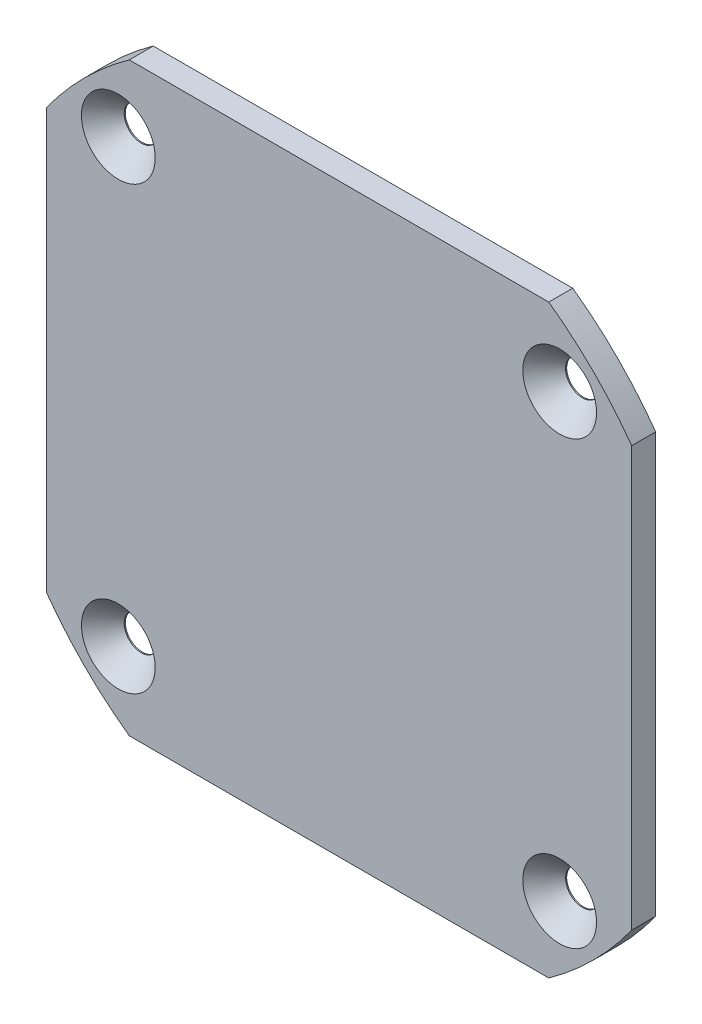
ISO-10303-21;
HEADER;
FILE_DESCRIPTION(('STEP AP214'),'2;1');
FILE_NAME('part.step','',(''),(''),'','','');
FILE_SCHEMA(('AUTOMOTIVE_DESIGN { 1 0 10303 214 1 1 1 1 }'));
ENDSEC;
DATA;
#1=APPLICATION_CONTEXT('core data for automotive mechanical design processes');
#2=APPLICATION_PROTOCOL_DEFINITION('international standard','automotive_design',2000,#1);
#3=PRODUCT_CONTEXT('',#1,'mechanical');
#4=PRODUCT('Part','Part','',(#3));
#5=PRODUCT_RELATED_PRODUCT_CATEGORY('part','',(#4));
#6=PRODUCT_DEFINITION_FORMATION('','',#4);
#7=PRODUCT_DEFINITION_CONTEXT('part definition',#1,'design');
#8=PRODUCT_DEFINITION('design','',#6,#7);
#9=PRODUCT_DEFINITION_SHAPE('','',#8);
#10=(LENGTH_UNIT() NAMED_UNIT(*) SI_UNIT(.MILLI.,.METRE.));
#11=(NAMED_UNIT(*) PLANE_ANGLE_UNIT() SI_UNIT($,.RADIAN.));
#12=(NAMED_UNIT(*) SI_UNIT($,.STERADIAN.) SOLID_ANGLE_UNIT());
#13=UNCERTAINTY_MEASURE_WITH_UNIT(LENGTH_MEASURE(1.E-05),#10,'distance_accuracy_value','');
#14=(GEOMETRIC_REPRESENTATION_CONTEXT(3) GLOBAL_UNCERTAINTY_ASSIGNED_CONTEXT((#13)) GLOBAL_UNIT_ASSIGNED_CONTEXT((#10,
#11,#12)) REPRESENTATION_CONTEXT('',''));
#15=CARTESIAN_POINT('',(0.,0.,0.));
#16=DIRECTION('',(0.,0.,1.));
#17=DIRECTION('',(1.,0.,0.));
#18=AXIS2_PLACEMENT_3D('',#15,#16,#17);
#19=CARTESIAN_POINT('',(0.,0.,0.));
#20=DIRECTION('',(0.,0.,1.));
#21=DIRECTION('',(1.,0.,0.));
#22=AXIS2_PLACEMENT_3D('',#19,#20,#21);
#23=PLANE('',#22);
#24=CARTESIAN_POINT('',(-29.1858323934746,29.1858323934749,0.));
#25=DIRECTION('',(0.,0.,1.));
#26=DIRECTION('',(1.,0.,0.));
#27=AXIS2_PLACEMENT_3D('',#24,#25,#26);
#28=CIRCLE('',#27,2.2479);
#29=CARTESIAN_POINT('',(-26.9379323934746,29.1858323934749,0.));
#30=VERTEX_POINT('',#29);
#31=EDGE_CURVE('E182',#30,#30,#28,.T.);
#32=ORIENTED_EDGE('',*,*,#31,.T.);
#33=EDGE_LOOP('',(#32));
#34=FACE_BOUND('',#33,.T.);
#35=CARTESIAN_POINT('',(-29.1858323934746,-29.1858323934749,0.));
#36=DIRECTION('',(0.,0.,1.));
#37=DIRECTION('',(1.,0.,0.));
#38=AXIS2_PLACEMENT_3D('',#35,#36,#37);
#39=CIRCLE('',#38,2.2479);
#40=CARTESIAN_POINT('',(-26.9379323934746,-29.1858323934749,0.));
#41=VERTEX_POINT('',#40);
#42=EDGE_CURVE('E173',#41,#41,#39,.T.);
#43=ORIENTED_EDGE('',*,*,#42,.T.);
#44=EDGE_LOOP('',(#43));
#45=FACE_BOUND('',#44,.T.);
#46=CARTESIAN_POINT('',(29.1858323934748,-29.1858323934747,0.));
#47=DIRECTION('',(0.,0.,1.));
#48=DIRECTION('',(1.,0.,0.));
#49=AXIS2_PLACEMENT_3D('',#46,#47,#48);
#50=CIRCLE('',#49,2.2479);
#51=CARTESIAN_POINT('',(31.4337323934748,-29.1858323934747,0.));
#52=VERTEX_POINT('',#51);
#53=EDGE_CURVE('E164',#52,#52,#50,.T.);
#54=ORIENTED_EDGE('',*,*,#53,.T.);
#55=EDGE_LOOP('',(#54));
#56=FACE_BOUND('',#55,.T.);
#57=CARTESIAN_POINT('',(29.1858323934746,29.1858323934749,0.));
#58=DIRECTION('',(0.,0.,1.));
#59=DIRECTION('',(1.,0.,0.));
#60=AXIS2_PLACEMENT_3D('',#57,#58,#59);
#61=CIRCLE('',#60,2.2479);
#62=CARTESIAN_POINT('',(31.4337323934746,29.1858323934749,0.));
#63=VERTEX_POINT('',#62);
#64=EDGE_CURVE('E149',#63,#63,#61,.T.);
#65=ORIENTED_EDGE('',*,*,#64,.T.);
#66=EDGE_LOOP('',(#65));
#67=FACE_BOUND('',#66,.T.);
#68=CARTESIAN_POINT('',(0.,0.,0.));
#69=DIRECTION('',(0.,0.,1.));
#70=DIRECTION('',(1.,0.,0.));
#71=AXIS2_PLACEMENT_3D('',#68,#69,#70);
#72=CIRCLE('',#71,38.1);
#73=CARTESIAN_POINT('',(38.1,0.,0.));
#74=VERTEX_POINT('',#73);
#75=EDGE_CURVE('E120',#74,#74,#72,.F.);
#76=ORIENTED_EDGE('',*,*,#75,.F.);
#77=EDGE_LOOP('',(#76));
#78=FACE_BOUND('',#77,.T.);
#79=DIRECTION('',(0.,1.,0.));
#80=VECTOR('',#79,1.);
#81=CARTESIAN_POINT('',(38.7108323934746,38.7108323934749,0.));
#82=LINE('',#81,#80);
#83=CARTESIAN_POINT('',(38.7108323934746,-27.7418831445221,0.));
#84=VERTEX_POINT('',#83);
#85=CARTESIAN_POINT('',(38.7108323934746,27.7418831445221,0.));
#86=VERTEX_POINT('',#85);
#87=EDGE_CURVE('E208',#84,#86,#82,.T.);
#88=ORIENTED_EDGE('',*,*,#87,.F.);
#89=CARTESIAN_POINT('',(0.,0.,0.));
#90=DIRECTION('',(0.,0.,1.));
#91=DIRECTION('',(1.,0.,0.));
#92=AXIS2_PLACEMENT_3D('',#89,#90,#91);
#93=CIRCLE('',#92,47.625);
#94=CARTESIAN_POINT('',(27.7418831445217,-38.7108323934749,0.));
#95=VERTEX_POINT('',#94);
#96=EDGE_CURVE('E145',#95,#84,#93,.T.);
#97=ORIENTED_EDGE('',*,*,#96,.F.);
#98=DIRECTION('',(1.,0.,0.));
#99=VECTOR('',#98,1.);
#100=CARTESIAN_POINT('',(-38.7108323934746,-38.7108323934749,0.));
#101=LINE('',#100,#99);
#102=CARTESIAN_POINT('',(-27.7418831445217,-38.7108323934749,0.));
#103=VERTEX_POINT('',#102);
#104=EDGE_CURVE('E202',#103,#95,#101,.T.);
#105=ORIENTED_EDGE('',*,*,#104,.F.);
#106=CARTESIAN_POINT('',(-38.7108323934746,-27.7418831445221,0.));
#107=VERTEX_POINT('',#106);
#108=EDGE_CURVE('E147',#107,#103,#93,.T.);
#109=ORIENTED_EDGE('',*,*,#108,.F.);
#110=DIRECTION('',(0.,-1.,0.));
#111=VECTOR('',#110,1.);
#112=CARTESIAN_POINT('',(-38.7108323934746,38.7108323934749,0.));
#113=LINE('',#112,#111);
#114=CARTESIAN_POINT('',(-38.7108323934746,27.7418831445221,0.));
#115=VERTEX_POINT('',#114);
#116=EDGE_CURVE('E204',#115,#107,#113,.T.);
#117=ORIENTED_EDGE('',*,*,#116,.F.);
#118=CARTESIAN_POINT('',(-27.7418831445217,38.7108323934749,0.));
#119=VERTEX_POINT('',#118);
#120=EDGE_CURVE('E144',#119,#115,#93,.T.);
#121=ORIENTED_EDGE('',*,*,#120,.F.);
#122=DIRECTION('',(-1.,0.,0.));
#123=VECTOR('',#122,1.);
#124=CARTESIAN_POINT('',(-38.7108323934746,38.7108323934749,0.));
#125=LINE('',#124,#123);
#126=CARTESIAN_POINT('',(27.7418831445217,38.7108323934749,0.));
#127=VERTEX_POINT('',#126);
#128=EDGE_CURVE('E206',#127,#119,#125,.T.);
#129=ORIENTED_EDGE('',*,*,#128,.F.);
#130=EDGE_CURVE('E129',#86,#127,#93,.T.);
#131=ORIENTED_EDGE('',*,*,#130,.F.);
#132=EDGE_LOOP('',(#88,#97,#105,#109,#117,#121,#129,#131));
#133=FACE_BOUND('',#132,.T.);
#134=ADVANCED_FACE('F44',(#34,#45,#56,#67,#78,#133),#23,.F.);
#135=CARTESIAN_POINT('',(0.,0.,3.175));
#136=DIRECTION('',(0.,0.,-1.));
#137=DIRECTION('',(-1.,0.,0.));
#138=AXIS2_PLACEMENT_3D('',#135,#136,#137);
#139=CYLINDRICAL_SURFACE('',#138,47.625);
#140=DIRECTION('',(0.,0.,-1.));
#141=VECTOR('',#140,1.);
#142=CARTESIAN_POINT('',(38.7108323934746,-27.7418831445221,3.175));
#143=LINE('',#142,#141);
#144=CARTESIAN_POINT('',(38.7108323934746,-27.7418831445221,3.175));
#145=VERTEX_POINT('',#144);
#146=EDGE_CURVE('E191',#145,#84,#143,.T.);
#147=ORIENTED_EDGE('',*,*,#146,.F.);
#148=CARTESIAN_POINT('',(0.,0.,3.175));
#149=DIRECTION('',(0.,0.,1.));
#150=DIRECTION('',(1.,0.,0.));
#151=AXIS2_PLACEMENT_3D('',#148,#149,#150);
#152=CIRCLE('',#151,47.625);
#153=CARTESIAN_POINT('',(27.7418831445217,-38.7108323934749,3.175));
#154=VERTEX_POINT('',#153);
#155=EDGE_CURVE('E135',#154,#145,#152,.T.);
#156=ORIENTED_EDGE('',*,*,#155,.F.);
#157=DIRECTION('',(0.,0.,-1.));
#158=VECTOR('',#157,1.);
#159=CARTESIAN_POINT('',(27.7418831445217,-38.7108323934749,3.175));
#160=LINE('',#159,#158);
#161=EDGE_CURVE('E59',#95,#154,#160,.F.);
#162=ORIENTED_EDGE('',*,*,#161,.F.);
#163=ORIENTED_EDGE('',*,*,#96,.T.);
#164=EDGE_LOOP('',(#147,#156,#162,#163));
#165=FACE_BOUND('',#164,.T.);
#166=ADVANCED_FACE('F46',(#165),#139,.T.);
#167=DIRECTION('',(0.,0.,-1.));
#168=VECTOR('',#167,1.);
#169=CARTESIAN_POINT('',(38.7108323934746,27.7418831445221,3.175));
#170=LINE('',#169,#168);
#171=CARTESIAN_POINT('',(38.7108323934746,27.7418831445221,3.175));
#172=VERTEX_POINT('',#171);
#173=EDGE_CURVE('E193',#86,#172,#170,.F.);
#174=ORIENTED_EDGE('',*,*,#173,.F.);
#175=ORIENTED_EDGE('',*,*,#130,.T.);
#176=DIRECTION('',(0.,0.,-1.));
#177=VECTOR('',#176,1.);
#178=CARTESIAN_POINT('',(27.7418831445217,38.7108323934749,3.175));
#179=LINE('',#178,#177);
#180=CARTESIAN_POINT('',(27.7418831445217,38.7108323934749,3.175));
#181=VERTEX_POINT('',#180);
#182=EDGE_CURVE('E111',#181,#127,#179,.T.);
#183=ORIENTED_EDGE('',*,*,#182,.F.);
#184=EDGE_CURVE('E127',#172,#181,#152,.T.);
#185=ORIENTED_EDGE('',*,*,#184,.F.);
#186=EDGE_LOOP('',(#174,#175,#183,#185));
#187=FACE_BOUND('',#186,.T.);
#188=ADVANCED_FACE('F126',(#187),#139,.T.);
#189=DIRECTION('',(0.,0.,-1.));
#190=VECTOR('',#189,1.);
#191=CARTESIAN_POINT('',(-27.7418831445217,-38.7108323934749,3.175));
#192=LINE('',#191,#190);
#193=CARTESIAN_POINT('',(-27.7418831445217,-38.7108323934749,3.175));
#194=VERTEX_POINT('',#193);
#195=EDGE_CURVE('E195',#194,#103,#192,.T.);
#196=ORIENTED_EDGE('',*,*,#195,.F.);
#197=CARTESIAN_POINT('',(-38.7108323934746,-27.7418831445221,3.175));
#198=VERTEX_POINT('',#197);
#199=EDGE_CURVE('E139',#198,#194,#152,.T.);
#200=ORIENTED_EDGE('',*,*,#199,.F.);
#201=DIRECTION('',(0.,0.,-1.));
#202=VECTOR('',#201,1.);
#203=CARTESIAN_POINT('',(-38.7108323934746,-27.7418831445221,3.175));
#204=LINE('',#203,#202);
#205=EDGE_CURVE('E67',#107,#198,#204,.F.);
#206=ORIENTED_EDGE('',*,*,#205,.F.);
#207=ORIENTED_EDGE('',*,*,#108,.T.);
#208=EDGE_LOOP('',(#196,#200,#206,#207));
#209=FACE_BOUND('',#208,.T.);
#210=ADVANCED_FACE('F222',(#209),#139,.T.);
#211=DIRECTION('',(0.,0.,-1.));
#212=VECTOR('',#211,1.);
#213=CARTESIAN_POINT('',(-38.7108323934746,27.7418831445221,3.175));
#214=LINE('',#213,#212);
#215=CARTESIAN_POINT('',(-38.7108323934746,27.7418831445221,3.175));
#216=VERTEX_POINT('',#215);
#217=EDGE_CURVE('E198',#216,#115,#214,.T.);
#218=ORIENTED_EDGE('',*,*,#217,.F.);
#219=CARTESIAN_POINT('',(-27.7418831445217,38.7108323934749,3.175));
#220=VERTEX_POINT('',#219);
#221=EDGE_CURVE('E133',#220,#216,#152,.T.);
#222=ORIENTED_EDGE('',*,*,#221,.F.);
#223=DIRECTION('',(0.,0.,-1.));
#224=VECTOR('',#223,1.);
#225=CARTESIAN_POINT('',(-27.7418831445217,38.7108323934749,3.175));
#226=LINE('',#225,#224);
#227=EDGE_CURVE('E114',#119,#220,#226,.F.);
#228=ORIENTED_EDGE('',*,*,#227,.F.);
#229=ORIENTED_EDGE('',*,*,#120,.T.);
#230=EDGE_LOOP('',(#218,#222,#228,#229));
#231=FACE_BOUND('',#230,.T.);
#232=ADVANCED_FACE('F217',(#231),#139,.T.);
#233=CARTESIAN_POINT('',(0.,0.,3.175));
#234=DIRECTION('',(0.,0.,1.));
#235=DIRECTION('',(1.,0.,0.));
#236=AXIS2_PLACEMENT_3D('',#233,#234,#235);
#237=PLANE('',#236);
#238=CARTESIAN_POINT('',(-29.1858323934746,29.1858323934749,3.175));
#239=DIRECTION('',(0.,0.,1.));
#240=DIRECTION('',(1.,0.,0.));
#241=AXIS2_PLACEMENT_3D('',#238,#239,#240);
#242=CIRCLE('',#241,4.8788066);
#243=CARTESIAN_POINT('',(-24.3070257934746,29.1858323934749,3.175));
#244=VERTEX_POINT('',#243);
#245=EDGE_CURVE('E188',#244,#244,#242,.T.);
#246=ORIENTED_EDGE('',*,*,#245,.F.);
#247=EDGE_LOOP('',(#246));
#248=FACE_BOUND('',#247,.T.);
#249=CARTESIAN_POINT('',(-29.1858323934746,-29.1858323934749,3.175));
#250=DIRECTION('',(0.,0.,1.));
#251=DIRECTION('',(1.,0.,0.));
#252=AXIS2_PLACEMENT_3D('',#249,#250,#251);
#253=CIRCLE('',#252,4.8788066);
#254=CARTESIAN_POINT('',(-24.3070257934746,-29.1858323934749,3.175));
#255=VERTEX_POINT('',#254);
#256=EDGE_CURVE('E179',#255,#255,#253,.T.);
#257=ORIENTED_EDGE('',*,*,#256,.F.);
#258=EDGE_LOOP('',(#257));
#259=FACE_BOUND('',#258,.T.);
#260=CARTESIAN_POINT('',(29.1858323934748,-29.1858323934747,3.175));
#261=DIRECTION('',(0.,0.,1.));
#262=DIRECTION('',(1.,0.,0.));
#263=AXIS2_PLACEMENT_3D('',#260,#261,#262);
#264=CIRCLE('',#263,4.8788066);
#265=CARTESIAN_POINT('',(34.0646389934748,-29.1858323934747,3.175));
#266=VERTEX_POINT('',#265);
#267=EDGE_CURVE('E170',#266,#266,#264,.T.);
#268=ORIENTED_EDGE('',*,*,#267,.F.);
#269=EDGE_LOOP('',(#268));
#270=FACE_BOUND('',#269,.T.);
#271=CARTESIAN_POINT('',(29.1858323934746,29.1858323934749,3.175));
#272=DIRECTION('',(0.,0.,1.));
#273=DIRECTION('',(1.,0.,0.));
#274=AXIS2_PLACEMENT_3D('',#271,#272,#273);
#275=CIRCLE('',#274,4.8788066);
#276=CARTESIAN_POINT('',(34.0646389934746,29.1858323934749,3.175));
#277=VERTEX_POINT('',#276);
#278=EDGE_CURVE('E159',#277,#277,#275,.T.);
#279=ORIENTED_EDGE('',*,*,#278,.F.);
#280=EDGE_LOOP('',(#279));
#281=FACE_BOUND('',#280,.T.);
#282=ORIENTED_EDGE('',*,*,#155,.T.);
#283=DIRECTION('',(0.,1.,0.));
#284=VECTOR('',#283,1.);
#285=CARTESIAN_POINT('',(38.7108323934746,0.,3.175));
#286=LINE('',#285,#284);
#287=EDGE_CURVE('E12',#145,#172,#286,.T.);
#288=ORIENTED_EDGE('',*,*,#287,.T.);
#289=ORIENTED_EDGE('',*,*,#184,.T.);
#290=DIRECTION('',(-1.,0.,0.));
#291=VECTOR('',#290,1.);
#292=CARTESIAN_POINT('',(0.,38.7108323934749,3.175));
#293=LINE('',#292,#291);
#294=EDGE_CURVE('E108',#181,#220,#293,.T.);
#295=ORIENTED_EDGE('',*,*,#294,.T.);
#296=ORIENTED_EDGE('',*,*,#221,.T.);
#297=DIRECTION('',(0.,-1.,0.));
#298=VECTOR('',#297,1.);
#299=CARTESIAN_POINT('',(-38.7108323934746,0.,3.175));
#300=LINE('',#299,#298);
#301=EDGE_CURVE('E119',#216,#198,#300,.T.);
#302=ORIENTED_EDGE('',*,*,#301,.T.);
#303=ORIENTED_EDGE('',*,*,#199,.T.);
#304=DIRECTION('',(1.,0.,0.));
#305=VECTOR('',#304,1.);
#306=CARTESIAN_POINT('',(0.,-38.7108323934749,3.175));
#307=LINE('',#306,#305);
#308=EDGE_CURVE('E52',#194,#154,#307,.T.);
#309=ORIENTED_EDGE('',*,*,#308,.T.);
#310=EDGE_LOOP('',(#282,#288,#289,#295,#296,#302,#303,#309));
#311=FACE_BOUND('',#310,.T.);
#312=ADVANCED_FACE('F132',(#248,#259,#270,#281,#311),#237,.T.);
#313=ORIENTED_EDGE('',*,*,#75,.T.);
#314=EDGE_LOOP('',(#313));
#315=FACE_BOUND('',#314,.T.);
#316=ADVANCED_FACE('F238',(#315),#23,.F.);
#317=CARTESIAN_POINT('',(29.1858323934746,29.1858323934749,3.175));
#318=DIRECTION('',(0.,0.,1.));
#319=DIRECTION('',(1.,0.,0.));
#320=AXIS2_PLACEMENT_3D('',#317,#318,#319);
#321=CYLINDRICAL_SURFACE('',#320,2.2479);
#322=ORIENTED_EDGE('',*,*,#64,.F.);
#323=EDGE_LOOP('',(#322));
#324=FACE_BOUND('',#323,.T.);
#325=CARTESIAN_POINT('',(29.1858323934746,29.1858323934749,0.148488165010757));
#326=DIRECTION('',(0.,0.,1.));
#327=DIRECTION('',(1.,0.,0.));
#328=AXIS2_PLACEMENT_3D('',#325,#326,#327);
#329=CIRCLE('',#328,2.2479);
#330=CARTESIAN_POINT('',(31.4337323934746,29.1858323934749,0.148488165010757));
#331=VERTEX_POINT('',#330);
#332=EDGE_CURVE('E155',#331,#331,#329,.T.);
#333=ORIENTED_EDGE('',*,*,#332,.T.);
#334=EDGE_LOOP('',(#333));
#335=FACE_BOUND('',#334,.T.);
#336=ADVANCED_FACE('F245',(#324,#335),#321,.F.);
#337=CARTESIAN_POINT('',(29.1858323934746,29.1858323934749,3.175));
#338=DIRECTION('',(0.,0.,1.));
#339=DIRECTION('',(1.,0.,0.));
#340=AXIS2_PLACEMENT_3D('',#337,#338,#339);
#341=CONICAL_SURFACE('',#340,4.8788066,0.715584993317674);
#342=ORIENTED_EDGE('',*,*,#332,.F.);
#343=EDGE_LOOP('',(#342));
#344=FACE_BOUND('',#343,.T.);
#345=ORIENTED_EDGE('',*,*,#278,.T.);
#346=EDGE_LOOP('',(#345));
#347=FACE_BOUND('',#346,.T.);
#348=ADVANCED_FACE('F251',(#344,#347),#341,.F.);
#349=CARTESIAN_POINT('',(29.1858323934748,-29.1858323934747,3.175));
#350=DIRECTION('',(0.,0.,1.));
#351=DIRECTION('',(1.,0.,0.));
#352=AXIS2_PLACEMENT_3D('',#349,#350,#351);
#353=CYLINDRICAL_SURFACE('',#352,2.2479);
#354=ORIENTED_EDGE('',*,*,#53,.F.);
#355=EDGE_LOOP('',(#354));
#356=FACE_BOUND('',#355,.T.);
#357=CARTESIAN_POINT('',(29.1858323934748,-29.1858323934747,0.148488165010757));
#358=DIRECTION('',(0.,0.,1.));
#359=DIRECTION('',(1.,0.,0.));
#360=AXIS2_PLACEMENT_3D('',#357,#358,#359);
#361=CIRCLE('',#360,2.2479);
#362=CARTESIAN_POINT('',(31.4337323934748,-29.1858323934747,0.148488165010757));
#363=VERTEX_POINT('',#362);
#364=EDGE_CURVE('E167',#363,#363,#361,.T.);
#365=ORIENTED_EDGE('',*,*,#364,.T.);
#366=EDGE_LOOP('',(#365));
#367=FACE_BOUND('',#366,.T.);
#368=ADVANCED_FACE('F265',(#356,#367),#353,.F.);
#369=CARTESIAN_POINT('',(29.1858323934748,-29.1858323934747,3.175));
#370=DIRECTION('',(0.,0.,1.));
#371=DIRECTION('',(1.,0.,0.));
#372=AXIS2_PLACEMENT_3D('',#369,#370,#371);
#373=CONICAL_SURFACE('',#372,4.8788066,0.715584993317674);
#374=ORIENTED_EDGE('',*,*,#364,.F.);
#375=EDGE_LOOP('',(#374));
#376=FACE_BOUND('',#375,.T.);
#377=ORIENTED_EDGE('',*,*,#267,.T.);
#378=EDGE_LOOP('',(#377));
#379=FACE_BOUND('',#378,.T.);
#380=ADVANCED_FACE('F269',(#376,#379),#373,.F.);
#381=CARTESIAN_POINT('',(-29.1858323934746,-29.1858323934749,3.175));
#382=DIRECTION('',(0.,0.,1.));
#383=DIRECTION('',(1.,0.,0.));
#384=AXIS2_PLACEMENT_3D('',#381,#382,#383);
#385=CYLINDRICAL_SURFACE('',#384,2.2479);
#386=ORIENTED_EDGE('',*,*,#42,.F.);
#387=EDGE_LOOP('',(#386));
#388=FACE_BOUND('',#387,.T.);
#389=CARTESIAN_POINT('',(-29.1858323934746,-29.1858323934749,0.148488165010757));
#390=DIRECTION('',(0.,0.,1.));
#391=DIRECTION('',(1.,0.,0.));
#392=AXIS2_PLACEMENT_3D('',#389,#390,#391);
#393=CIRCLE('',#392,2.2479);
#394=CARTESIAN_POINT('',(-26.9379323934746,-29.1858323934749,0.148488165010757));
#395=VERTEX_POINT('',#394);
#396=EDGE_CURVE('E176',#395,#395,#393,.T.);
#397=ORIENTED_EDGE('',*,*,#396,.T.);
#398=EDGE_LOOP('',(#397));
#399=FACE_BOUND('',#398,.T.);
#400=ADVANCED_FACE('F273',(#388,#399),#385,.F.);
#401=CARTESIAN_POINT('',(-29.1858323934746,-29.1858323934749,3.175));
#402=DIRECTION('',(0.,0.,1.));
#403=DIRECTION('',(1.,0.,0.));
#404=AXIS2_PLACEMENT_3D('',#401,#402,#403);
#405=CONICAL_SURFACE('',#404,4.8788066,0.715584993317676);
#406=ORIENTED_EDGE('',*,*,#396,.F.);
#407=EDGE_LOOP('',(#406));
#408=FACE_BOUND('',#407,.T.);
#409=ORIENTED_EDGE('',*,*,#256,.T.);
#410=EDGE_LOOP('',(#409));
#411=FACE_BOUND('',#410,.T.);
#412=ADVANCED_FACE('F277',(#408,#411),#405,.F.);
#413=CARTESIAN_POINT('',(-29.1858323934746,29.1858323934749,3.175));
#414=DIRECTION('',(0.,0.,1.));
#415=DIRECTION('',(1.,0.,0.));
#416=AXIS2_PLACEMENT_3D('',#413,#414,#415);
#417=CYLINDRICAL_SURFACE('',#416,2.2479);
#418=ORIENTED_EDGE('',*,*,#31,.F.);
#419=EDGE_LOOP('',(#418));
#420=FACE_BOUND('',#419,.T.);
#421=CARTESIAN_POINT('',(-29.1858323934746,29.1858323934749,0.148488165010757));
#422=DIRECTION('',(0.,0.,1.));
#423=DIRECTION('',(1.,0.,0.));
#424=AXIS2_PLACEMENT_3D('',#421,#422,#423);
#425=CIRCLE('',#424,2.2479);
#426=CARTESIAN_POINT('',(-26.9379323934746,29.1858323934749,0.148488165010757));
#427=VERTEX_POINT('',#426);
#428=EDGE_CURVE('E185',#427,#427,#425,.T.);
#429=ORIENTED_EDGE('',*,*,#428,.T.);
#430=EDGE_LOOP('',(#429));
#431=FACE_BOUND('',#430,.T.);
#432=ADVANCED_FACE('F281',(#420,#431),#417,.F.);
#433=CARTESIAN_POINT('',(-29.1858323934746,29.1858323934749,3.175));
#434=DIRECTION('',(0.,0.,1.));
#435=DIRECTION('',(1.,0.,0.));
#436=AXIS2_PLACEMENT_3D('',#433,#434,#435);
#437=CONICAL_SURFACE('',#436,4.8788066,0.715584993317676);
#438=ORIENTED_EDGE('',*,*,#428,.F.);
#439=EDGE_LOOP('',(#438));
#440=FACE_BOUND('',#439,.T.);
#441=ORIENTED_EDGE('',*,*,#245,.T.);
#442=EDGE_LOOP('',(#441));
#443=FACE_BOUND('',#442,.T.);
#444=ADVANCED_FACE('F234',(#440,#443),#437,.F.);
#445=CARTESIAN_POINT('',(-38.7108323934746,38.7108323934749,0.));
#446=DIRECTION('',(0.,1.,0.));
#447=DIRECTION('',(0.,0.,1.));
#448=AXIS2_PLACEMENT_3D('',#445,#446,#447);
#449=PLANE('',#448);
#450=ORIENTED_EDGE('',*,*,#182,.T.);
#451=ORIENTED_EDGE('',*,*,#128,.T.);
#452=ORIENTED_EDGE('',*,*,#227,.T.);
#453=ORIENTED_EDGE('',*,*,#294,.F.);
#454=EDGE_LOOP('',(#450,#451,#452,#453));
#455=FACE_BOUND('',#454,.T.);
#456=ADVANCED_FACE('F110',(#455),#449,.T.);
#457=CARTESIAN_POINT('',(-38.7108323934746,38.7108323934749,0.));
#458=DIRECTION('',(-1.,0.,0.));
#459=DIRECTION('',(0.,0.,1.));
#460=AXIS2_PLACEMENT_3D('',#457,#458,#459);
#461=PLANE('',#460);
#462=ORIENTED_EDGE('',*,*,#217,.T.);
#463=ORIENTED_EDGE('',*,*,#116,.T.);
#464=ORIENTED_EDGE('',*,*,#205,.T.);
#465=ORIENTED_EDGE('',*,*,#301,.F.);
#466=EDGE_LOOP('',(#462,#463,#464,#465));
#467=FACE_BOUND('',#466,.T.);
#468=ADVANCED_FACE('F226',(#467),#461,.T.);
#469=CARTESIAN_POINT('',(-38.7108323934746,-38.7108323934749,0.));
#470=DIRECTION('',(0.,-1.,0.));
#471=DIRECTION('',(0.,0.,-1.));
#472=AXIS2_PLACEMENT_3D('',#469,#470,#471);
#473=PLANE('',#472);
#474=ORIENTED_EDGE('',*,*,#195,.T.);
#475=ORIENTED_EDGE('',*,*,#104,.T.);
#476=ORIENTED_EDGE('',*,*,#161,.T.);
#477=ORIENTED_EDGE('',*,*,#308,.F.);
#478=EDGE_LOOP('',(#474,#475,#476,#477));
#479=FACE_BOUND('',#478,.T.);
#480=ADVANCED_FACE('F225',(#479),#473,.T.);
#481=CARTESIAN_POINT('',(38.7108323934746,38.7108323934749,0.));
#482=DIRECTION('',(1.,0.,0.));
#483=DIRECTION('',(0.,0.,-1.));
#484=AXIS2_PLACEMENT_3D('',#481,#482,#483);
#485=PLANE('',#484);
#486=ORIENTED_EDGE('',*,*,#146,.T.);
#487=ORIENTED_EDGE('',*,*,#87,.T.);
#488=ORIENTED_EDGE('',*,*,#173,.T.);
#489=ORIENTED_EDGE('',*,*,#287,.F.);
#490=EDGE_LOOP('',(#486,#487,#488,#489));
#491=FACE_BOUND('',#490,.T.);
#492=ADVANCED_FACE('F211',(#491),#485,.T.);
#493=CLOSED_SHELL('',(#134,#166,#188,#210,#232,#312,#316,#336,#348,#368,#380,#400,#412,#432,
#444,#456,#468,#480,#492));
#494=MANIFOLD_SOLID_BREP('B2',#493);
#495=ADVANCED_BREP_SHAPE_REPRESENTATION('',(#18,#494),#14);
#496=SHAPE_DEFINITION_REPRESENTATION(#9,#495);
ENDSEC;
END-ISO-10303-21;
